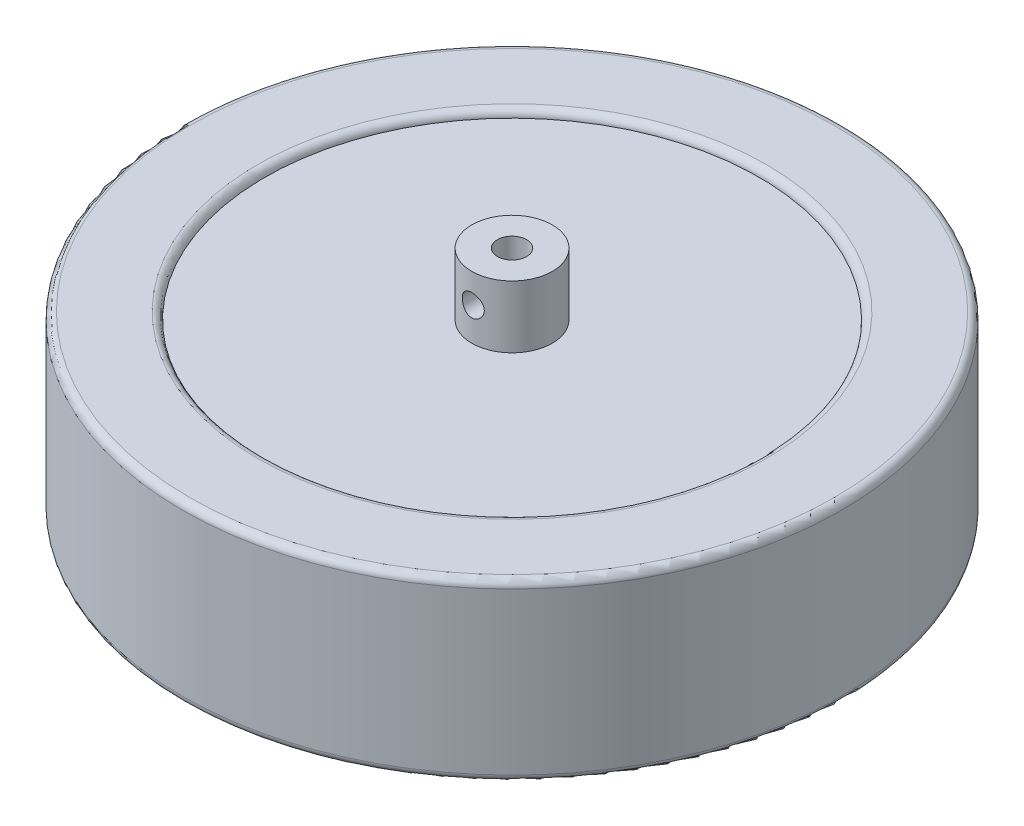
ISO-10303-21;
HEADER;
FILE_DESCRIPTION(('STEP AP214'),'2;1');
FILE_NAME('part.step','',(''),(''),'','','');
FILE_SCHEMA(('AUTOMOTIVE_DESIGN { 1 0 10303 214 1 1 1 1 }'));
ENDSEC;
DATA;
#1=APPLICATION_CONTEXT('core data for automotive mechanical design processes');
#2=APPLICATION_PROTOCOL_DEFINITION('international standard','automotive_design',2000,#1);
#3=PRODUCT_CONTEXT('',#1,'mechanical');
#4=PRODUCT('Part','Part','',(#3));
#5=PRODUCT_RELATED_PRODUCT_CATEGORY('part','',(#4));
#6=PRODUCT_DEFINITION_FORMATION('','',#4);
#7=PRODUCT_DEFINITION_CONTEXT('part definition',#1,'design');
#8=PRODUCT_DEFINITION('design','',#6,#7);
#9=PRODUCT_DEFINITION_SHAPE('','',#8);
#10=(LENGTH_UNIT() NAMED_UNIT(*) SI_UNIT(.MILLI.,.METRE.));
#11=(NAMED_UNIT(*) PLANE_ANGLE_UNIT() SI_UNIT($,.RADIAN.));
#12=(NAMED_UNIT(*) SI_UNIT($,.STERADIAN.) SOLID_ANGLE_UNIT());
#13=UNCERTAINTY_MEASURE_WITH_UNIT(LENGTH_MEASURE(1.E-05),#10,'distance_accuracy_value','');
#14=(GEOMETRIC_REPRESENTATION_CONTEXT(3) GLOBAL_UNCERTAINTY_ASSIGNED_CONTEXT((#13)) GLOBAL_UNIT_ASSIGNED_CONTEXT((#10,
#11,#12)) REPRESENTATION_CONTEXT('',''));
#15=CARTESIAN_POINT('',(0.,0.,0.));
#16=DIRECTION('',(0.,0.,1.));
#17=DIRECTION('',(1.,0.,0.));
#18=AXIS2_PLACEMENT_3D('',#15,#16,#17);
#19=CARTESIAN_POINT('',(0.,63.,0.));
#20=DIRECTION('',(0.,-1.,0.));
#21=DIRECTION('',(0.,0.,-1.));
#22=AXIS2_PLACEMENT_3D('',#19,#20,#21);
#23=CYLINDRICAL_SURFACE('',#22,11.);
#24=CARTESIAN_POINT('',(0.,63.,0.));
#25=DIRECTION('',(0.,1.,0.));
#26=DIRECTION('',(0.,0.,1.));
#27=AXIS2_PLACEMENT_3D('',#24,#25,#26);
#28=CIRCLE('',#27,11.);
#29=CARTESIAN_POINT('',(0.,63.,11.));
#30=VERTEX_POINT('',#29);
#31=EDGE_CURVE('E84',#30,#30,#28,.T.);
#32=ORIENTED_EDGE('',*,*,#31,.F.);
#33=EDGE_LOOP('',(#32));
#34=FACE_BOUND('',#33,.T.);
#35=CARTESIAN_POINT('',(0.,46.,0.));
#36=DIRECTION('',(0.,1.,0.));
#37=DIRECTION('',(0.,0.,1.));
#38=AXIS2_PLACEMENT_3D('',#35,#36,#37);
#39=CIRCLE('',#38,11.);
#40=CARTESIAN_POINT('',(0.,46.,11.));
#41=VERTEX_POINT('',#40);
#42=EDGE_CURVE('E85',#41,#41,#39,.T.);
#43=ORIENTED_EDGE('',*,*,#42,.T.);
#44=EDGE_LOOP('',(#43));
#45=FACE_BOUND('',#44,.T.);
#46=CARTESIAN_POINT('',(-3.,55.,10.5830052442584));
#47=CARTESIAN_POINT('',(-2.99999631394217,54.8348870979423,10.583007958691));
#48=CARTESIAN_POINT('',(-2.9863224317348,54.6697357800884,10.5869115609735));
#49=CARTESIAN_POINT('',(-2.93209821184804,54.3442129494006,10.6020548381034));
#50=CARTESIAN_POINT('',(-2.8915351938393,54.1838437290031,10.6132979740766));
#51=CARTESIAN_POINT('',(-2.78497349245513,53.8726416240761,10.6417543479045));
#52=CARTESIAN_POINT('',(-2.71901169395373,53.7217952781915,10.6589589247646));
#53=CARTESIAN_POINT('',(-2.56364148046497,53.4332837315266,10.697388502605));
#54=CARTESIAN_POINT('',(-2.47423093939754,53.2956197275254,10.7186138680988));
#55=CARTESIAN_POINT('',(-2.27199971714032,53.0337795864173,10.7633157269056));
#56=CARTESIAN_POINT('',(-2.15867548436928,52.9099993432439,10.786833581786));
#57=CARTESIAN_POINT('',(-1.9129160544093,52.682944684549,10.8331142058485));
#58=CARTESIAN_POINT('',(-1.78047880100251,52.579672478168,10.8558768934638));
#59=CARTESIAN_POINT('',(-1.49749518483003,52.394902746379,10.898545441737));
#60=CARTESIAN_POINT('',(-1.3466817662362,52.3138005563471,10.9183968296209));
#61=CARTESIAN_POINT('',(-1.03292742411298,52.1782542636343,10.9525304511732));
#62=CARTESIAN_POINT('',(-0.869988649206005,52.1238054508516,10.9668136687405));
#63=CARTESIAN_POINT('',(-0.54074290369605,52.0443978034389,10.9879091215097));
#64=CARTESIAN_POINT('',(-0.374609566838586,52.0187651115705,10.994891791957));
#65=CARTESIAN_POINT('',(-0.0402637429494967,51.9955953954041,11.0011960452895));
#66=CARTESIAN_POINT('',(0.127948375581464,51.9980534609111,11.0005189670801));
#67=CARTESIAN_POINT('',(0.456980121405168,52.0305247972968,10.9917041280665));
#68=CARTESIAN_POINT('',(0.617877718859158,52.0598097466385,10.9837635712747));
#69=CARTESIAN_POINT('',(0.932382009793442,52.1439246646912,10.9615478819394));
#70=CARTESIAN_POINT('',(1.08598827764441,52.1987561226568,10.9472723800974));
#71=CARTESIAN_POINT('',(1.38338647378973,52.3329542716859,10.9137017775887));
#72=CARTESIAN_POINT('',(1.52706155098294,52.412566897375,10.8943566836113));
#73=CARTESIAN_POINT('',(1.79925853732223,52.5938777885352,10.852725757155));
#74=CARTESIAN_POINT('',(1.92777736815591,52.6955805287443,10.8304393292169));
#75=CARTESIAN_POINT('',(2.17036149751678,52.92203599024,10.784492415915));
#76=CARTESIAN_POINT('',(2.28383106523422,53.0474233438751,10.7608107858484));
#77=CARTESIAN_POINT('',(2.48828152564665,53.3156904302332,10.715383975544));
#78=CARTESIAN_POINT('',(2.57926091364812,53.4585713323971,10.6936389249343));
#79=CARTESIAN_POINT('',(2.73663009812326,53.7591087879817,10.6544594320219));
#80=CARTESIAN_POINT('',(2.80285088541273,53.9168580114682,10.6370548781093));
#81=CARTESIAN_POINT('',(2.90763299613953,54.2418452043766,10.6088947081252));
#82=CARTESIAN_POINT('',(2.94620154355457,54.4090806832439,10.5981373556147));
#83=CARTESIAN_POINT('',(2.99354252921382,54.7427043630485,10.5848615034452));
#84=CARTESIAN_POINT('',(3.0032065812715,54.9089563735496,10.5820965560097));
#85=CARTESIAN_POINT('',(2.99492665221736,55.2407022870886,10.5844430221321));
#86=CARTESIAN_POINT('',(2.97698576378155,55.4061962729674,10.5895535533732));
#87=CARTESIAN_POINT('',(2.91479275923711,55.7282448746142,10.6068364060829));
#88=CARTESIAN_POINT('',(2.87108313218805,55.8849128412573,10.6188630043201));
#89=CARTESIAN_POINT('',(2.75920663677019,56.1886920198635,10.6484790285967));
#90=CARTESIAN_POINT('',(2.69103646733415,56.335801938756,10.6660692054297));
#91=CARTESIAN_POINT('',(2.53038481558079,56.6200014163333,10.7053313595423));
#92=CARTESIAN_POINT('',(2.43738334790319,56.7567851490098,10.7270874317935));
#93=CARTESIAN_POINT('',(2.23034883245409,57.0131321307705,10.7720352546733));
#94=CARTESIAN_POINT('',(2.11631164274843,57.1326919802003,10.7952272874441));
#95=CARTESIAN_POINT('',(1.86630672600238,57.3549327279012,10.8412873004258));
#96=CARTESIAN_POINT('',(1.7297776950392,57.4569900068684,10.8641239958047));
#97=CARTESIAN_POINT('',(1.44101111501377,57.636741270182,10.9061791332427));
#98=CARTESIAN_POINT('',(1.28877440221759,57.7144365506556,10.9253977677713));
#99=CARTESIAN_POINT('',(0.973984676303823,57.8425341325158,10.9579274645047));
#100=CARTESIAN_POINT('',(0.811520026490854,57.893141780601,10.9712828319589));
#101=CARTESIAN_POINT('',(0.479971729445639,57.9662139050902,10.9907764764024));
#102=CARTESIAN_POINT('',(0.31088963124763,57.9886849276538,10.9969164320813));
#103=CARTESIAN_POINT('',(-0.0232794393640319,58.0044202401812,11.0012041471382));
#104=CARTESIAN_POINT('',(-0.188320818610346,57.9985973426135,10.9996016998911));
#105=CARTESIAN_POINT('',(-0.514982609274361,57.96004044538,10.9891537057497));
#106=CARTESIAN_POINT('',(-0.676603159542358,57.9273075401393,10.980308453419));
#107=CARTESIAN_POINT('',(-0.990684067393571,57.8363852593212,10.9564222583548));
#108=CARTESIAN_POINT('',(-1.14320402358952,57.7783886035202,10.9414282698753));
#109=CARTESIAN_POINT('',(-1.43643473924553,57.6387567569291,10.9068088184094));
#110=CARTESIAN_POINT('',(-1.57714378146592,57.5571181363842,10.8871826835111));
#111=CARTESIAN_POINT('',(-1.84697735038909,57.3698905434392,10.8447157469266));
#112=CARTESIAN_POINT('',(-1.97567408641904,57.2637018551366,10.821801074927));
#113=CARTESIAN_POINT('',(-2.21372992386849,57.0315157228896,10.77562687508));
#114=CARTESIAN_POINT('',(-2.32308384950928,56.9055129940604,10.7523672567304));
#115=CARTESIAN_POINT('',(-2.52187932121526,56.6337449463718,10.7075101554702));
#116=CARTESIAN_POINT('',(-2.61079759566744,56.4875875947723,10.685964021802));
#117=CARTESIAN_POINT('',(-2.76267612596911,56.1818281098363,10.6477131133895));
#118=CARTESIAN_POINT('',(-2.82565261339771,56.0222344590163,10.6310053132866));
#119=CARTESIAN_POINT('',(-2.91605222306045,55.7194639614692,10.6065296317478));
#120=CARTESIAN_POINT('',(-2.94745662446349,55.5775430624901,10.5977813362995));
#121=CARTESIAN_POINT('',(-2.98943081578313,55.2904244042015,10.5860183115613));
#122=CARTESIAN_POINT('',(-3.00000324211702,55.1452270618994,10.5830028567461));
#123=CARTESIAN_POINT('',(-3.,55.,10.5830052442584));
#124=B_SPLINE_CURVE_WITH_KNOTS('',3,(#46,#47,#48,#49,#50,#51,#52,#53,#54,#55,#56,#57,#58,#59,
#60,#61,#62,#63,#64,#65,#66,#67,#68,#69,#70,#71,#72,#73,#74,#75,#76,#77,#78,#79,#80,#81,#82,#83,
#84,#85,#86,#87,#88,#89,#90,#91,#92,#93,#94,#95,#96,#97,#98,#99,#100,#101,#102,#103,#104,#105,
#106,#107,#108,#109,#110,#111,#112,#113,#114,#115,#116,#117,#118,#119,#120,#121,#122,#123),
.UNSPECIFIED.,.T.,.F.,(4,2,2,2,2,2,2,2,2,2,2,2,2,2,2,2,2,2,2,2,2,2,2,2,2,2,2,2,2,2,2,2,2,2,2,2,
2,2,4),(0.,0.494804402783945,0.989842310673487,1.48416400458283,1.97853053377771,
2.48458654001652,2.99069702943608,3.50531765639172,4.01984730833293,4.52207686042122,
5.02421862536769,5.51311924771328,6.0020483744866,6.49599339426236,6.99003856468469,
7.49992833732447,8.00985221464117,8.52319603663079,9.03640570178774,9.53361223089934,
10.0307630603168,10.5178037490719,11.0049101910351,11.5031485099097,12.0014850368415,
12.5149711336561,13.0284299069195,13.5379390354896,14.0473296015752,14.5403975209342,
15.0334453883032,15.5227962513149,16.0122181403599,16.5151701080202,17.0182564534142,
17.5330636246647,18.0475481939115,18.4828145157885,18.9180257484398),.UNSPECIFIED.);
#125=CARTESIAN_POINT('',(-3.,55.,10.5830052442584));
#126=VERTEX_POINT('',#125);
#127=EDGE_CURVE('E97',#126,#126,#124,.T.);
#128=ORIENTED_EDGE('',*,*,#127,.F.);
#129=EDGE_LOOP('',(#128));
#130=FACE_BOUND('',#129,.T.);
#131=ADVANCED_FACE('F39',(#34,#45,#130),#23,.T.);
#132=CARTESIAN_POINT('',(0.,48.,0.));
#133=DIRECTION('',(0.,1.,0.));
#134=DIRECTION('',(0.,0.,1.));
#135=AXIS2_PLACEMENT_3D('',#132,#133,#134);
#136=CYLINDRICAL_SURFACE('',#135,4.);
#137=CARTESIAN_POINT('',(0.,48.,0.));
#138=DIRECTION('',(0.,1.,0.));
#139=DIRECTION('',(0.,0.,1.));
#140=AXIS2_PLACEMENT_3D('',#137,#138,#139);
#141=CIRCLE('',#140,4.);
#142=CARTESIAN_POINT('',(0.,48.,4.));
#143=VERTEX_POINT('',#142);
#144=EDGE_CURVE('E89',#143,#143,#141,.T.);
#145=ORIENTED_EDGE('',*,*,#144,.F.);
#146=EDGE_LOOP('',(#145));
#147=FACE_BOUND('',#146,.T.);
#148=CARTESIAN_POINT('',(0.,63.,0.));
#149=DIRECTION('',(0.,1.,0.));
#150=DIRECTION('',(0.,0.,1.));
#151=AXIS2_PLACEMENT_3D('',#148,#149,#150);
#152=CIRCLE('',#151,4.);
#153=CARTESIAN_POINT('',(0.,63.,4.));
#154=VERTEX_POINT('',#153);
#155=EDGE_CURVE('E93',#154,#154,#152,.T.);
#156=ORIENTED_EDGE('',*,*,#155,.T.);
#157=EDGE_LOOP('',(#156));
#158=FACE_BOUND('',#157,.T.);
#159=CARTESIAN_POINT('',(0.,52.,4.));
#160=CARTESIAN_POINT('',(-0.0732613677680275,52.000000742019,3.99999929901188));
#161=CARTESIAN_POINT('',(-0.146542351053628,52.0026905069869,3.99798060344642));
#162=CARTESIAN_POINT('',(-0.292508538993505,52.013394860135,3.98996245699389));
#163=CARTESIAN_POINT('',(-0.365193360793216,52.0214126345048,3.98396062416369));
#164=CARTESIAN_POINT('',(-0.581731406983922,52.0533359060282,3.96012745087107));
#165=CARTESIAN_POINT('',(-0.723892660392385,52.0851109579911,3.93646888013437));
#166=CARTESIAN_POINT('',(-0.998506639011302,52.1674252075752,3.87591490407891));
#167=CARTESIAN_POINT('',(-1.13101263465653,52.2178503483829,3.83910000314071));
#168=CARTESIAN_POINT('',(-1.38483526994092,52.3350853669315,3.75501017021524));
#169=CARTESIAN_POINT('',(-1.50615516858413,52.4018904515835,3.70773829853535));
#170=CARTESIAN_POINT('',(-1.74693213195157,52.5565237252206,3.60099357013528));
#171=CARTESIAN_POINT('',(-1.86517631030519,52.6457258512733,3.54079623314279));
#172=CARTESIAN_POINT('',(-2.08606449940779,52.839000495843,3.41533027981218));
#173=CARTESIAN_POINT('',(-2.18868391091458,52.9430959724478,3.35005390635213));
#174=CARTESIAN_POINT('',(-2.33993228026195,53.1205353441046,3.24492237261661));
#175=CARTESIAN_POINT('',(-2.39379458304145,53.1896301124095,3.2052891581058));
#176=CARTESIAN_POINT('',(-2.49548358548256,53.3325891308243,3.12676887933752));
#177=CARTESIAN_POINT('',(-2.54330846513548,53.4064548090511,3.0878820430606));
#178=CARTESIAN_POINT('',(-2.63261178619331,53.5587717948802,3.01210562553027));
#179=CARTESIAN_POINT('',(-2.67409784691839,53.6372174379625,2.9752136814322));
#180=CARTESIAN_POINT('',(-2.75043132677141,53.798707047549,2.90479339731391));
#181=CARTESIAN_POINT('',(-2.78527982077503,53.8817502667139,2.87126451310281));
#182=CARTESIAN_POINT('',(-2.85760090658949,54.0789622754237,2.7995453278082));
#183=CARTESIAN_POINT('',(-2.89251037008408,54.1947697739346,2.76315561923757));
#184=CARTESIAN_POINT('',(-2.94841656316143,54.4327970631341,2.70343128888206));
#185=CARTESIAN_POINT('',(-2.96944514417499,54.5550014743367,2.6800667983994));
#186=CARTESIAN_POINT('',(-2.99625559824299,54.8043620244718,2.65007535494332));
#187=CARTESIAN_POINT('',(-3.00189887157292,54.9315527732834,2.6436005765876));
#188=CARTESIAN_POINT('',(-2.99696449042943,55.1852306622291,2.64919059245027));
#189=CARTESIAN_POINT('',(-2.98638102048541,55.311717533795,2.66126203341492));
#190=CARTESIAN_POINT('',(-2.95195473462658,55.5463825040596,2.69935247502785));
#191=CARTESIAN_POINT('',(-2.92964971367058,55.6550726901358,2.72374314386008));
#192=CARTESIAN_POINT('',(-2.87411343637385,55.8668778094483,2.78228385423355));
#193=CARTESIAN_POINT('',(-2.84087167817736,55.9699872726139,2.81644327194565));
#194=CARTESIAN_POINT('',(-2.74066127604792,56.2325127456874,2.91483538729993));
#195=CARTESIAN_POINT('',(-2.6656029678939,56.3868008258836,2.9845129831659));
#196=CARTESIAN_POINT('',(-2.49236046828094,56.6783930551597,3.13066596252174));
#197=CARTESIAN_POINT('',(-2.3941200856505,56.8156546805156,3.20715757761233));
#198=CARTESIAN_POINT('',(-2.17303208149636,57.0755067787506,3.36103344637552));
#199=CARTESIAN_POINT('',(-2.04962751039983,57.1976412132322,3.43839173465929));
#200=CARTESIAN_POINT('',(-1.78084504353984,57.420527294092,3.58496075956505));
#201=CARTESIAN_POINT('',(-1.63551010852546,57.5213198405288,3.65418696517002));
#202=CARTESIAN_POINT('',(-1.35580416095789,57.6799615984263,3.76559452155695));
#203=CARTESIAN_POINT('',(-1.2250797406269,57.7423691885745,3.81041541916803));
#204=CARTESIAN_POINT('',(-0.95270434614867,57.8484497607849,3.88745808807126));
#205=CARTESIAN_POINT('',(-0.811060281155398,57.8921344763732,3.91968774910058));
#206=CARTESIAN_POINT('',(-0.519352465945106,57.9585067264021,3.96891177371227));
#207=CARTESIAN_POINT('',(-0.369242566477485,57.9810643602572,3.98581186314606));
#208=CARTESIAN_POINT('',(-0.0664024759297772,58.0030991923644,4.00231766947939));
#209=CARTESIAN_POINT('',(0.0863265824213284,58.0025861285056,4.0019306830649));
#210=CARTESIAN_POINT('',(0.373608422358575,57.9797782694453,3.98485095596869));
#211=CARTESIAN_POINT('',(0.508444611327589,57.9596789546577,3.96980177630783));
#212=CARTESIAN_POINT('',(0.772221384992239,57.9020524115432,3.92702635972251));
#213=CARTESIAN_POINT('',(0.901160708783233,57.8645214748398,3.89929742534594));
#214=CARTESIAN_POINT('',(1.15483339082488,57.7722250483285,3.83199678428177));
#215=CARTESIAN_POINT('',(1.27925770587446,57.7168980524501,3.79204165281684));
#216=CARTESIAN_POINT('',(1.51703769337244,57.5916546737865,3.70333906113673));
#217=CARTESIAN_POINT('',(1.63039183139362,57.5217362727012,3.65459038471486));
#218=CARTESIAN_POINT('',(1.86302046499997,57.356435318386,3.54238575945113));
#219=CARTESIAN_POINT('',(1.98012231440925,57.2587502052204,3.47783324855999));
#220=CARTESIAN_POINT('',(2.19745073328884,57.0479751943654,3.34476768394493));
#221=CARTESIAN_POINT('',(2.29763880438283,56.9348511853368,3.27624605925973));
#222=CARTESIAN_POINT('',(2.44323760962617,56.7431701696575,3.16783641864784));
#223=CARTESIAN_POINT('',(2.49441207840988,56.6691421417943,3.12757855224153));
#224=CARTESIAN_POINT('',(2.59024776181559,56.5161732778725,3.04868523124073));
#225=CARTESIAN_POINT('',(2.63490658340165,56.4372306519145,3.01005037642924));
#226=CARTESIAN_POINT('',(2.75840992843589,56.1934171318121,2.89884735629486));
#227=CARTESIAN_POINT('',(2.82722866554621,56.0209781238401,2.83062934493711));
#228=CARTESIAN_POINT('',(2.91232161832908,55.7291537657546,2.74237306217227));
#229=CARTESIAN_POINT('',(2.9386220669607,55.6152131595087,2.71391502535151));
#230=CARTESIAN_POINT('',(2.97782857114493,55.3825904834344,2.67084233048458));
#231=CARTESIAN_POINT('',(2.99076452454844,55.2639196166269,2.65619677881271));
#232=CARTESIAN_POINT('',(3.00230698654587,55.0243408049391,2.64315167964507));
#233=CARTESIAN_POINT('',(3.00084075038308,54.9034245855455,2.64483460597191));
#234=CARTESIAN_POINT('',(2.98353723231362,54.6638858503217,2.66432917886907));
#235=CARTESIAN_POINT('',(2.96768140541027,54.5452664961795,2.68216163855031));
#236=CARTESIAN_POINT('',(2.91787829237152,54.2881744244149,2.73634639677127));
#237=CARTESIAN_POINT('',(2.88073715900692,54.1510207653594,2.77589185811733));
#238=CARTESIAN_POINT('',(2.78938673066516,53.886915138293,2.86766153434691));
#239=CARTESIAN_POINT('',(2.73513432117032,53.759989968088,2.91991769887726));
#240=CARTESIAN_POINT('',(2.63161322454639,53.5567275201652,3.01293440174584));
#241=CARTESIAN_POINT('',(2.58648316812387,53.4773851437047,3.05189072454866));
#242=CARTESIAN_POINT('',(2.48962257782421,53.3236852764673,3.13140535919095));
#243=CARTESIAN_POINT('',(2.43789239621903,53.2493275199664,3.17196358545148));
#244=CARTESIAN_POINT('',(2.32800429973167,53.1056445392896,3.25347248479456));
#245=CARTESIAN_POINT('',(2.26984095281445,53.0363236512392,3.2944234624514));
#246=CARTESIAN_POINT('',(2.14725580217514,52.9029798251337,3.37560324351171));
#247=CARTESIAN_POINT('',(2.08283369004459,52.8389571484426,3.41583201121156));
#248=CARTESIAN_POINT('',(1.94728190281493,52.7160266669227,3.49489651383714));
#249=CARTESIAN_POINT('',(1.87609990910411,52.6571669186394,3.53371751668996));
#250=CARTESIAN_POINT('',(1.72767987087949,52.5456702429373,3.60860502556334));
#251=CARTESIAN_POINT('',(1.65044310433561,52.4930320082052,3.64467210969304));
#252=CARTESIAN_POINT('',(1.49030317410488,52.3946580579452,3.71302541445826));
#253=CARTESIAN_POINT('',(1.4074101813953,52.348910403568,3.74531815238003));
#254=CARTESIAN_POINT('',(1.23634243548289,52.2649432839566,3.80521640467831));
#255=CARTESIAN_POINT('',(1.14817043896903,52.2267199334935,3.83282433706672));
#256=CARTESIAN_POINT('',(0.929739140257499,52.1444373010329,3.89270294176925));
#257=CARTESIAN_POINT('',(0.797123031201966,52.1044756371824,3.92219862865418));
#258=CARTESIAN_POINT('',(0.525667463530544,52.0431551204107,3.96768259876898));
#259=CARTESIAN_POINT('',(0.386846538130169,52.0217443132116,3.98370860194081));
#260=CARTESIAN_POINT('',(0.205928000583056,52.0067907013765,3.994909382017));
#261=CARTESIAN_POINT('',(0.164816108820126,52.004246897179,3.99681576437034));
#262=CARTESIAN_POINT('',(0.0824715620592881,52.0008512014683,3.99936137264782));
#263=CARTESIAN_POINT('',(0.0412388886906457,51.9999995823169,4.00000039458683));
#264=CARTESIAN_POINT('',(0.,52.,4.));
#265=B_SPLINE_CURVE_WITH_KNOTS('',3,(#159,#160,#161,#162,#163,#164,#165,#166,#167,#168,#169,
#170,#171,#172,#173,#174,#175,#176,#177,#178,#179,#180,#181,#182,#183,#184,#185,#186,#187,#188,
#189,#190,#191,#192,#193,#194,#195,#196,#197,#198,#199,#200,#201,#202,#203,#204,#205,#206,#207,
#208,#209,#210,#211,#212,#213,#214,#215,#216,#217,#218,#219,#220,#221,#222,#223,#224,#225,#226,
#227,#228,#229,#230,#231,#232,#233,#234,#235,#236,#237,#238,#239,#240,#241,#242,#243,#244,#245,
#246,#247,#248,#249,#250,#251,#252,#253,#254,#255,#256,#257,#258,#259,#260,#261,#262,#263,#264),
.UNSPECIFIED.,.T.,.F.,(4,2,2,2,2,2,2,2,2,2,2,2,2,2,2,2,2,2,2,2,2,2,2,2,2,2,2,2,2,2,2,2,2,2,2,2,
2,2,2,2,2,2,2,2,2,2,2,2,2,2,2,2,4),(0.,0.219733524191398,0.439598569068991,0.879847634771394,
1.31744766307167,1.7549197936235,2.2329036222735,2.71163236402815,2.9998351852719,
3.28812468015057,3.57606487508903,3.86395840178997,4.24151729125786,4.61820678456564,
4.99827867308496,5.37848680666402,5.718064723914,6.05796967267263,6.61051355677805,
7.16441076781762,7.73224459942165,8.29898017053365,8.75205702078762,9.20484951352218,
9.66040808399781,10.1157743699921,10.5253506608997,10.9350141243761,11.3591357103334,
11.7833160002107,12.2783345622972,12.7744651003689,13.0698938265097,13.3654307846348,
13.9540907813181,14.3138420927746,14.6727868466003,15.0335455414111,15.3947698355934,
15.8348522835192,16.276052567115,16.5734564783343,16.8708445226936,17.1684856206865,
17.4661413927621,17.7663250552985,18.0664455283282,18.3660398682405,18.6654791022959,
19.0884486476652,19.5102297424977,19.6338980344064,19.7575862294511),.UNSPECIFIED.);
#266=CARTESIAN_POINT('',(0.,52.,4.));
#267=VERTEX_POINT('',#266);
#268=EDGE_CURVE('E43',#267,#267,#265,.T.);
#269=ORIENTED_EDGE('',*,*,#268,.F.);
#270=EDGE_LOOP('',(#269));
#271=FACE_BOUND('',#270,.T.);
#272=ADVANCED_FACE('F120',(#147,#158,#271),#136,.F.);
#273=CARTESIAN_POINT('',(0.,48.,0.));
#274=DIRECTION('',(0.,-1.,0.));
#275=DIRECTION('',(0.,0.,-1.));
#276=AXIS2_PLACEMENT_3D('',#273,#274,#275);
#277=CYLINDRICAL_SURFACE('',#276,90.);
#278=CARTESIAN_POINT('',(0.,2.,0.));
#279=DIRECTION('',(0.,1.,0.));
#280=DIRECTION('',(0.,0.,1.));
#281=AXIS2_PLACEMENT_3D('',#278,#279,#280);
#282=CIRCLE('',#281,90.);
#283=CARTESIAN_POINT('',(0.,2.,90.));
#284=VERTEX_POINT('',#283);
#285=EDGE_CURVE('E10',#284,#284,#282,.T.);
#286=ORIENTED_EDGE('',*,*,#285,.T.);
#287=EDGE_LOOP('',(#286));
#288=FACE_BOUND('',#287,.T.);
#289=CARTESIAN_POINT('',(0.,46.,0.));
#290=DIRECTION('',(0.,1.,0.));
#291=DIRECTION('',(0.,0.,1.));
#292=AXIS2_PLACEMENT_3D('',#289,#290,#291);
#293=CIRCLE('',#292,90.);
#294=CARTESIAN_POINT('',(0.,46.,90.));
#295=VERTEX_POINT('',#294);
#296=EDGE_CURVE('E53',#295,#295,#293,.F.);
#297=ORIENTED_EDGE('',*,*,#296,.T.);
#298=EDGE_LOOP('',(#297));
#299=FACE_BOUND('',#298,.T.);
#300=ADVANCED_FACE('F123',(#288,#299),#277,.T.);
#301=CARTESIAN_POINT('',(0.,48.,0.));
#302=DIRECTION('',(0.,1.,0.));
#303=DIRECTION('',(0.,0.,1.));
#304=AXIS2_PLACEMENT_3D('',#301,#302,#303);
#305=PLANE('',#304);
#306=CARTESIAN_POINT('',(0.,48.,0.));
#307=DIRECTION('',(0.,1.,0.));
#308=DIRECTION('',(0.,0.,1.));
#309=AXIS2_PLACEMENT_3D('',#306,#307,#308);
#310=CIRCLE('',#309,69.5);
#311=CARTESIAN_POINT('',(0.,48.,69.5));
#312=VERTEX_POINT('',#311);
#313=EDGE_CURVE('E58',#312,#312,#310,.F.);
#314=ORIENTED_EDGE('',*,*,#313,.T.);
#315=EDGE_LOOP('',(#314));
#316=FACE_BOUND('',#315,.T.);
#317=CARTESIAN_POINT('',(0.,48.,0.));
#318=DIRECTION('',(0.,1.,0.));
#319=DIRECTION('',(0.,0.,1.));
#320=AXIS2_PLACEMENT_3D('',#317,#318,#319);
#321=CIRCLE('',#320,88.);
#322=CARTESIAN_POINT('',(0.,48.,88.));
#323=VERTEX_POINT('',#322);
#324=EDGE_CURVE('E64',#323,#323,#321,.T.);
#325=ORIENTED_EDGE('',*,*,#324,.T.);
#326=EDGE_LOOP('',(#325));
#327=FACE_BOUND('',#326,.T.);
#328=ADVANCED_FACE('F169',(#316,#327),#305,.T.);
#329=CARTESIAN_POINT('',(0.,0.,0.));
#330=DIRECTION('',(0.,1.,0.));
#331=DIRECTION('',(0.,0.,1.));
#332=AXIS2_PLACEMENT_3D('',#329,#330,#331);
#333=PLANE('',#332);
#334=CARTESIAN_POINT('',(0.,0.,0.));
#335=DIRECTION('',(0.,1.,0.));
#336=DIRECTION('',(0.,0.,1.));
#337=AXIS2_PLACEMENT_3D('',#334,#335,#336);
#338=CIRCLE('',#337,69.5);
#339=CARTESIAN_POINT('',(0.,0.,69.5));
#340=VERTEX_POINT('',#339);
#341=EDGE_CURVE('E68',#340,#340,#338,.T.);
#342=ORIENTED_EDGE('',*,*,#341,.T.);
#343=EDGE_LOOP('',(#342));
#344=FACE_BOUND('',#343,.T.);
#345=CARTESIAN_POINT('',(0.,0.,0.));
#346=DIRECTION('',(0.,1.,0.));
#347=DIRECTION('',(0.,0.,1.));
#348=AXIS2_PLACEMENT_3D('',#345,#346,#347);
#349=CIRCLE('',#348,88.);
#350=CARTESIAN_POINT('',(0.,0.,88.));
#351=VERTEX_POINT('',#350);
#352=EDGE_CURVE('E72',#351,#351,#349,.F.);
#353=ORIENTED_EDGE('',*,*,#352,.T.);
#354=EDGE_LOOP('',(#353));
#355=FACE_BOUND('',#354,.T.);
#356=ADVANCED_FACE('F149',(#344,#355),#333,.F.);
#357=CARTESIAN_POINT('',(0.,46.,0.));
#358=DIRECTION('',(0.,1.,0.));
#359=DIRECTION('',(0.,0.,1.));
#360=AXIS2_PLACEMENT_3D('',#357,#358,#359);
#361=PLANE('',#360);
#362=ORIENTED_EDGE('',*,*,#42,.F.);
#363=EDGE_LOOP('',(#362));
#364=FACE_BOUND('',#363,.T.);
#365=CARTESIAN_POINT('',(0.,46.,0.));
#366=DIRECTION('',(0.,1.,0.));
#367=DIRECTION('',(0.,0.,1.));
#368=AXIS2_PLACEMENT_3D('',#365,#366,#367);
#369=CIRCLE('',#368,67.5);
#370=CARTESIAN_POINT('',(0.,46.,67.5));
#371=VERTEX_POINT('',#370);
#372=EDGE_CURVE('E76',#371,#371,#369,.T.);
#373=ORIENTED_EDGE('',*,*,#372,.T.);
#374=EDGE_LOOP('',(#373));
#375=FACE_BOUND('',#374,.T.);
#376=ADVANCED_FACE('F145',(#364,#375),#361,.T.);
#377=CARTESIAN_POINT('',(0.,2.,0.));
#378=DIRECTION('',(0.,-1.,0.));
#379=DIRECTION('',(0.,0.,-1.));
#380=AXIS2_PLACEMENT_3D('',#377,#378,#379);
#381=PLANE('',#380);
#382=CARTESIAN_POINT('',(0.,2.,0.));
#383=DIRECTION('',(0.,-1.,0.));
#384=DIRECTION('',(0.,0.,-1.));
#385=AXIS2_PLACEMENT_3D('',#382,#383,#384);
#386=CIRCLE('',#385,67.5);
#387=CARTESIAN_POINT('',(0.,2.,-67.5));
#388=VERTEX_POINT('',#387);
#389=EDGE_CURVE('E80',#388,#388,#386,.T.);
#390=ORIENTED_EDGE('',*,*,#389,.T.);
#391=EDGE_LOOP('',(#390));
#392=FACE_BOUND('',#391,.T.);
#393=ADVANCED_FACE('F148',(#392),#381,.T.);
#394=CARTESIAN_POINT('',(0.,2.,0.));
#395=DIRECTION('',(0.,1.,0.));
#396=DIRECTION('',(0.,0.,1.));
#397=AXIS2_PLACEMENT_3D('',#394,#395,#396);
#398=TOROIDAL_SURFACE('',#397,69.5,2.);
#399=ORIENTED_EDGE('',*,*,#341,.F.);
#400=EDGE_LOOP('',(#399));
#401=FACE_BOUND('',#400,.T.);
#402=ORIENTED_EDGE('',*,*,#389,.F.);
#403=EDGE_LOOP('',(#402));
#404=FACE_BOUND('',#403,.T.);
#405=ADVANCED_FACE('F155',(#401,#404),#398,.T.);
#406=CARTESIAN_POINT('',(0.,46.,0.));
#407=DIRECTION('',(0.,1.,0.));
#408=DIRECTION('',(0.,0.,1.));
#409=AXIS2_PLACEMENT_3D('',#406,#407,#408);
#410=TOROIDAL_SURFACE('',#409,69.5,2.);
#411=ORIENTED_EDGE('',*,*,#313,.F.);
#412=EDGE_LOOP('',(#411));
#413=FACE_BOUND('',#412,.T.);
#414=ORIENTED_EDGE('',*,*,#372,.F.);
#415=EDGE_LOOP('',(#414));
#416=FACE_BOUND('',#415,.T.);
#417=ADVANCED_FACE('F153',(#413,#416),#410,.T.);
#418=CARTESIAN_POINT('',(0.,2.,0.));
#419=DIRECTION('',(0.,1.,0.));
#420=DIRECTION('',(0.,0.,1.));
#421=AXIS2_PLACEMENT_3D('',#418,#419,#420);
#422=TOROIDAL_SURFACE('',#421,88.,2.);
#423=ORIENTED_EDGE('',*,*,#352,.F.);
#424=EDGE_LOOP('',(#423));
#425=FACE_BOUND('',#424,.T.);
#426=ORIENTED_EDGE('',*,*,#285,.F.);
#427=EDGE_LOOP('',(#426));
#428=FACE_BOUND('',#427,.T.);
#429=ADVANCED_FACE('F130',(#425,#428),#422,.T.);
#430=CARTESIAN_POINT('',(0.,46.,0.));
#431=DIRECTION('',(0.,1.,0.));
#432=DIRECTION('',(0.,0.,1.));
#433=AXIS2_PLACEMENT_3D('',#430,#431,#432);
#434=TOROIDAL_SURFACE('',#433,88.,2.);
#435=ORIENTED_EDGE('',*,*,#296,.F.);
#436=EDGE_LOOP('',(#435));
#437=FACE_BOUND('',#436,.T.);
#438=ORIENTED_EDGE('',*,*,#324,.F.);
#439=EDGE_LOOP('',(#438));
#440=FACE_BOUND('',#439,.T.);
#441=ADVANCED_FACE('F41',(#437,#440),#434,.T.);
#442=CARTESIAN_POINT('',(0.,63.,0.));
#443=DIRECTION('',(0.,1.,0.));
#444=DIRECTION('',(0.,0.,1.));
#445=AXIS2_PLACEMENT_3D('',#442,#443,#444);
#446=PLANE('',#445);
#447=ORIENTED_EDGE('',*,*,#155,.F.);
#448=EDGE_LOOP('',(#447));
#449=FACE_BOUND('',#448,.T.);
#450=ORIENTED_EDGE('',*,*,#31,.T.);
#451=EDGE_LOOP('',(#450));
#452=FACE_BOUND('',#451,.T.);
#453=ADVANCED_FACE('F118',(#449,#452),#446,.T.);
#454=CARTESIAN_POINT('',(0.,48.,0.));
#455=DIRECTION('',(0.,1.,0.));
#456=DIRECTION('',(0.,0.,1.));
#457=AXIS2_PLACEMENT_3D('',#454,#455,#456);
#458=PLANE('',#457);
#459=ORIENTED_EDGE('',*,*,#144,.T.);
#460=EDGE_LOOP('',(#459));
#461=FACE_BOUND('',#460,.T.);
#462=ADVANCED_FACE('F114',(#461),#458,.T.);
#463=CARTESIAN_POINT('',(0.,55.,15.));
#464=DIRECTION('',(0.,0.,-1.));
#465=DIRECTION('',(-1.,0.,0.));
#466=AXIS2_PLACEMENT_3D('',#463,#464,#465);
#467=CYLINDRICAL_SURFACE('',#466,3.);
#468=ORIENTED_EDGE('',*,*,#268,.T.);
#469=EDGE_LOOP('',(#468));
#470=FACE_BOUND('',#469,.T.);
#471=ORIENTED_EDGE('',*,*,#127,.T.);
#472=EDGE_LOOP('',(#471));
#473=FACE_BOUND('',#472,.T.);
#474=ADVANCED_FACE('F110',(#470,#473),#467,.F.);
#475=CLOSED_SHELL('',(#131,#272,#300,#328,#356,#376,#393,#405,#417,#429,#441,#453,#462,#474));
#476=MANIFOLD_SOLID_BREP('B2',#475);
#477=ADVANCED_BREP_SHAPE_REPRESENTATION('',(#18,#476),#14);
#478=SHAPE_DEFINITION_REPRESENTATION(#9,#477);
ENDSEC;
END-ISO-10303-21;
